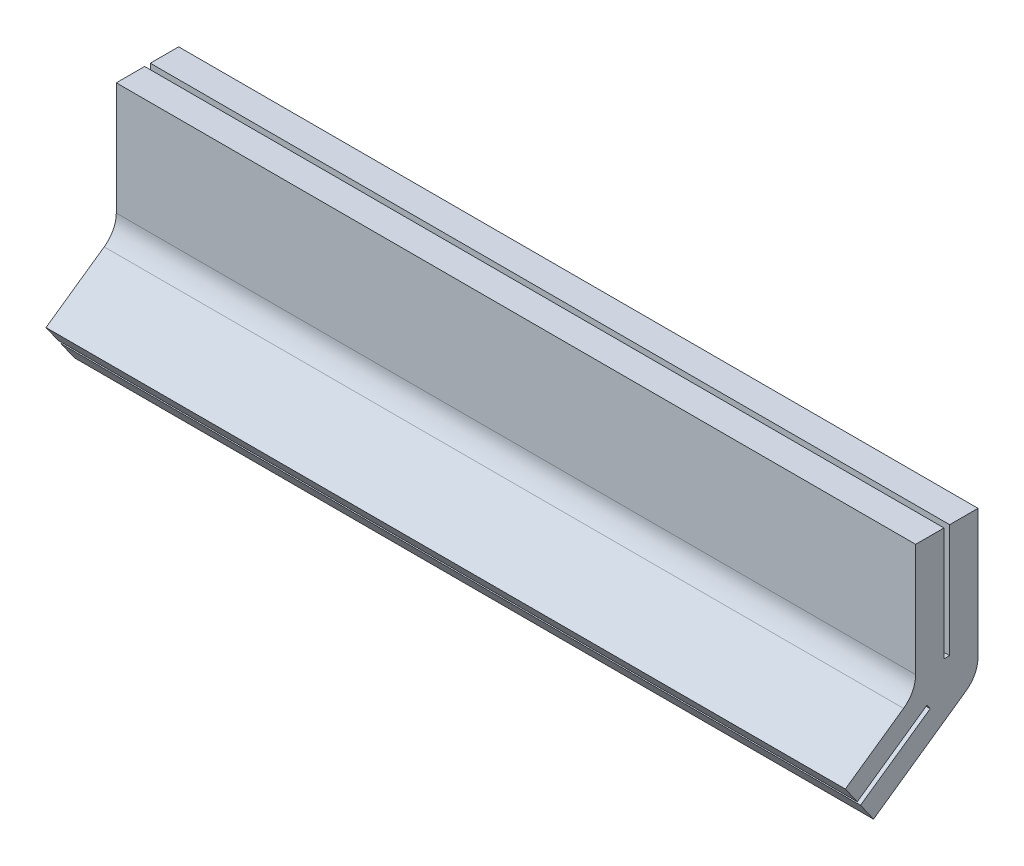
ISO-10303-21;
HEADER;
FILE_DESCRIPTION(('STEP AP214'),'2;1');
FILE_NAME('part.step','',(''),(''),'','','');
FILE_SCHEMA(('AUTOMOTIVE_DESIGN { 1 0 10303 214 1 1 1 1 }'));
ENDSEC;
DATA;
#1=APPLICATION_CONTEXT('core data for automotive mechanical design processes');
#2=APPLICATION_PROTOCOL_DEFINITION('international standard','automotive_design',2000,#1);
#3=PRODUCT_CONTEXT('',#1,'mechanical');
#4=PRODUCT('Part','Part','',(#3));
#5=PRODUCT_RELATED_PRODUCT_CATEGORY('part','',(#4));
#6=PRODUCT_DEFINITION_FORMATION('','',#4);
#7=PRODUCT_DEFINITION_CONTEXT('part definition',#1,'design');
#8=PRODUCT_DEFINITION('design','',#6,#7);
#9=PRODUCT_DEFINITION_SHAPE('','',#8);
#10=(LENGTH_UNIT() NAMED_UNIT(*) SI_UNIT(.MILLI.,.METRE.));
#11=(NAMED_UNIT(*) PLANE_ANGLE_UNIT() SI_UNIT($,.RADIAN.));
#12=(NAMED_UNIT(*) SI_UNIT($,.STERADIAN.) SOLID_ANGLE_UNIT());
#13=UNCERTAINTY_MEASURE_WITH_UNIT(LENGTH_MEASURE(1.E-05),#10,'distance_accuracy_value','');
#14=(GEOMETRIC_REPRESENTATION_CONTEXT(3) GLOBAL_UNCERTAINTY_ASSIGNED_CONTEXT((#13)) GLOBAL_UNIT_ASSIGNED_CONTEXT((#10,
#11,#12)) REPRESENTATION_CONTEXT('',''));
#15=CARTESIAN_POINT('',(0.,0.,0.));
#16=DIRECTION('',(0.,0.,1.));
#17=DIRECTION('',(1.,0.,0.));
#18=AXIS2_PLACEMENT_3D('',#15,#16,#17);
#19=CARTESIAN_POINT('',(280.717319350341,-285.,-311.284735655454));
#20=DIRECTION('',(0.,1.,0.));
#21=DIRECTION('',(0.,0.,1.));
#22=AXIS2_PLACEMENT_3D('',#19,#20,#21);
#23=PLANE('',#22);
#24=DIRECTION('',(0.,0.,-1.));
#25=VECTOR('',#24,1.);
#26=CARTESIAN_POINT('',(141.,-285.,-311.284735655454));
#27=LINE('',#26,#25);
#28=CARTESIAN_POINT('',(141.,-285.,-311.284735655454));
#29=VERTEX_POINT('',#28);
#30=CARTESIAN_POINT('',(141.,-285.,-321.284735655454));
#31=VERTEX_POINT('',#30);
#32=EDGE_CURVE('E206',#29,#31,#27,.T.);
#33=ORIENTED_EDGE('',*,*,#32,.T.);
#34=DIRECTION('',(-1.,0.,0.));
#35=VECTOR('',#34,1.);
#36=CARTESIAN_POINT('',(280.717319350341,-285.,-321.284735655454));
#37=LINE('',#36,#35);
#38=CARTESIAN_POINT('',(-141.,-285.,-321.284735655454));
#39=VERTEX_POINT('',#38);
#40=EDGE_CURVE('E258',#31,#39,#37,.T.);
#41=ORIENTED_EDGE('',*,*,#40,.T.);
#42=DIRECTION('',(0.,0.,-1.));
#43=VECTOR('',#42,1.);
#44=CARTESIAN_POINT('',(-141.,-285.,-311.284735655454));
#45=LINE('',#44,#43);
#46=CARTESIAN_POINT('',(-141.,-285.,-311.284735655454));
#47=VERTEX_POINT('',#46);
#48=EDGE_CURVE('E173',#47,#39,#45,.T.);
#49=ORIENTED_EDGE('',*,*,#48,.F.);
#50=DIRECTION('',(-1.,0.,0.));
#51=VECTOR('',#50,1.);
#52=CARTESIAN_POINT('',(280.717319350341,-285.,-311.284735655454));
#53=LINE('',#52,#51);
#54=EDGE_CURVE('E157',#29,#47,#53,.T.);
#55=ORIENTED_EDGE('',*,*,#54,.F.);
#56=EDGE_LOOP('',(#33,#41,#49,#55));
#57=FACE_BOUND('',#56,.T.);
#58=ADVANCED_FACE('F34',(#57),#23,.T.);
#59=CARTESIAN_POINT('',(141.,-200.,-321.284735655454));
#60=DIRECTION('',(1.,0.,0.));
#61=DIRECTION('',(0.,0.,-1.));
#62=AXIS2_PLACEMENT_3D('',#59,#60,#61);
#63=PLANE('',#62);
#64=DIRECTION('',(0.,1.,0.));
#65=VECTOR('',#64,1.);
#66=CARTESIAN_POINT('',(141.,-200.,-323.284735655454));
#67=LINE('',#66,#65);
#68=CARTESIAN_POINT('',(141.,-325.,-323.284735655454));
#69=VERTEX_POINT('',#68);
#70=CARTESIAN_POINT('',(141.,-285.,-323.284735655454));
#71=VERTEX_POINT('',#70);
#72=EDGE_CURVE('E194',#69,#71,#67,.T.);
#73=ORIENTED_EDGE('',*,*,#72,.F.);
#74=DIRECTION('',(0.,0.,-1.));
#75=VECTOR('',#74,1.);
#76=CARTESIAN_POINT('',(141.,-325.,-321.284735655454));
#77=LINE('',#76,#75);
#78=CARTESIAN_POINT('',(141.,-325.,-321.284735655454));
#79=VERTEX_POINT('',#78);
#80=EDGE_CURVE('E264',#79,#69,#77,.T.);
#81=ORIENTED_EDGE('',*,*,#80,.F.);
#82=DIRECTION('',(0.,1.,0.));
#83=VECTOR('',#82,1.);
#84=CARTESIAN_POINT('',(141.,-200.,-321.284735655454));
#85=LINE('',#84,#83);
#86=EDGE_CURVE('E262',#79,#31,#85,.T.);
#87=ORIENTED_EDGE('',*,*,#86,.T.);
#88=ORIENTED_EDGE('',*,*,#32,.F.);
#89=DIRECTION('',(0.,-1.,0.));
#90=VECTOR('',#89,1.);
#91=CARTESIAN_POINT('',(141.,-285.,-311.284735655454));
#92=LINE('',#91,#90);
#93=CARTESIAN_POINT('',(141.,-324.794329494483,-311.284735655454));
#94=VERTEX_POINT('',#93);
#95=EDGE_CURVE('E202',#29,#94,#92,.T.);
#96=ORIENTED_EDGE('',*,*,#95,.T.);
#97=CARTESIAN_POINT('',(141.,-324.794329494483,-301.284735655454));
#98=DIRECTION('',(1.,0.,0.));
#99=DIRECTION('',(0.,1.,0.));
#100=AXIS2_PLACEMENT_3D('',#97,#98,#99);
#101=CIRCLE('',#100,9.99999999999996);
#102=CARTESIAN_POINT('',(141.,-332.985849937373,-307.020500018964));
#103=VERTEX_POINT('',#102);
#104=EDGE_CURVE('E154',#103,#94,#101,.T.);
#105=ORIENTED_EDGE('',*,*,#104,.F.);
#106=DIRECTION('',(0.,-0.573576436351041,0.819152044288996));
#107=VECTOR('',#106,1.);
#108=CARTESIAN_POINT('',(141.,-332.985849937373,-307.020500018964));
#109=LINE('',#108,#107);
#110=CARTESIAN_POINT('',(141.,-347.361888814537,-286.489388751694));
#111=VERTEX_POINT('',#110);
#112=EDGE_CURVE('E211',#103,#111,#109,.T.);
#113=ORIENTED_EDGE('',*,*,#112,.T.);
#114=DIRECTION('',(0.,0.819152044288993,0.573576436351045));
#115=VECTOR('',#114,1.);
#116=CARTESIAN_POINT('',(141.,-353.356883609905,-290.687129298939));
#117=LINE('',#116,#115);
#118=CARTESIAN_POINT('',(141.,-353.356883609905,-290.687129298939));
#119=VERTEX_POINT('',#118);
#120=EDGE_CURVE('E216',#119,#111,#117,.T.);
#121=ORIENTED_EDGE('',*,*,#120,.F.);
#122=DIRECTION('',(0.,0.57357643635104,-0.819152044288996));
#123=VECTOR('',#122,1.);
#124=CARTESIAN_POINT('',(141.,-353.356883609905,-290.687129298939));
#125=LINE('',#124,#123);
#126=CARTESIAN_POINT('',(141.,-336.149590519374,-315.261690627609));
#127=VERTEX_POINT('',#126);
#128=EDGE_CURVE('E215',#119,#127,#125,.T.);
#129=ORIENTED_EDGE('',*,*,#128,.T.);
#130=DIRECTION('',(0.,-0.819152044288991,-0.573576436351048));
#131=VECTOR('',#130,1.);
#132=CARTESIAN_POINT('',(141.,-336.149590519374,-315.261690627609));
#133=LINE('',#132,#131);
#134=CARTESIAN_POINT('',(141.,-337.787894607952,-316.408843500311));
#135=VERTEX_POINT('',#134);
#136=EDGE_CURVE('E222',#127,#135,#133,.T.);
#137=ORIENTED_EDGE('',*,*,#136,.T.);
#138=DIRECTION('',(0.,-0.57357643635104,0.819152044288996));
#139=VECTOR('',#138,1.);
#140=CARTESIAN_POINT('',(141.,-337.787894607952,-316.408843500311));
#141=LINE('',#140,#139);
#142=CARTESIAN_POINT('',(141.,-354.994945144309,-291.834628574901));
#143=VERTEX_POINT('',#142);
#144=EDGE_CURVE('E200',#135,#143,#141,.T.);
#145=ORIENTED_EDGE('',*,*,#144,.T.);
#146=DIRECTION('',(0.,0.819182374444961,0.573533117961566));
#147=VECTOR('',#146,1.);
#148=CARTESIAN_POINT('',(141.,-361.546671381373,-296.421680364583));
#149=LINE('',#148,#147);
#150=CARTESIAN_POINT('',(141.,-361.546671381373,-296.421680364583));
#151=VERTEX_POINT('',#150);
#152=EDGE_CURVE('E58',#151,#143,#149,.T.);
#153=ORIENTED_EDGE('',*,*,#152,.F.);
#154=DIRECTION('',(0.,-0.573576436351039,0.819152044288997));
#155=VECTOR('',#154,1.);
#156=CARTESIAN_POINT('',(141.,-338.603613927331,-329.187762136143));
#157=LINE('',#156,#155);
#158=CARTESIAN_POINT('',(141.,-338.603613927331,-329.187762136143));
#159=VERTEX_POINT('',#158);
#160=EDGE_CURVE('E93',#159,#151,#157,.T.);
#161=ORIENTED_EDGE('',*,*,#160,.F.);
#162=CARTESIAN_POINT('',(141.,-330.53179391148,-323.284735655454));
#163=DIRECTION('',(1.,0.,0.));
#164=DIRECTION('',(0.,1.,0.));
#165=AXIS2_PLACEMENT_3D('',#162,#163,#164);
#166=CIRCLE('',#165,10.);
#167=CARTESIAN_POINT('',(141.,-330.53179391148,-333.284735655454));
#168=VERTEX_POINT('',#167);
#169=EDGE_CURVE('E197',#159,#168,#166,.T.);
#170=ORIENTED_EDGE('',*,*,#169,.T.);
#171=DIRECTION('',(0.,-1.,0.));
#172=VECTOR('',#171,1.);
#173=CARTESIAN_POINT('',(141.,-285.,-333.284735655454));
#174=LINE('',#173,#172);
#175=CARTESIAN_POINT('',(141.,-285.,-333.284735655454));
#176=VERTEX_POINT('',#175);
#177=EDGE_CURVE('E203',#176,#168,#174,.T.);
#178=ORIENTED_EDGE('',*,*,#177,.F.);
#179=EDGE_CURVE('E209',#71,#176,#27,.T.);
#180=ORIENTED_EDGE('',*,*,#179,.F.);
#181=EDGE_LOOP('',(#73,#81,#87,#88,#96,#105,#113,#121,#129,#137,#145,#153,#161,#170,#178,#180));
#182=FACE_BOUND('',#181,.T.);
#183=ADVANCED_FACE('F36',(#182),#63,.T.);
#184=CARTESIAN_POINT('',(280.717319350341,-338.603613927331,-329.187762136143));
#185=DIRECTION('',(0.,-0.819152044288997,-0.573576436351039));
#186=DIRECTION('',(0.,0.573576436351039,-0.819152044288997));
#187=AXIS2_PLACEMENT_3D('',#184,#185,#186);
#188=PLANE('',#187);
#189=DIRECTION('',(-1.,0.,0.));
#190=VECTOR('',#189,1.);
#191=CARTESIAN_POINT('',(280.717319350341,-338.603613927331,-329.187762136143));
#192=LINE('',#191,#190);
#193=CARTESIAN_POINT('',(-141.,-338.603613927331,-329.187762136143));
#194=VERTEX_POINT('',#193);
#195=EDGE_CURVE('E228',#159,#194,#192,.T.);
#196=ORIENTED_EDGE('',*,*,#195,.F.);
#197=ORIENTED_EDGE('',*,*,#160,.T.);
#198=DIRECTION('',(-1.,0.,0.));
#199=VECTOR('',#198,1.);
#200=CARTESIAN_POINT('',(280.717319350341,-361.546671381373,-296.421680364583));
#201=LINE('',#200,#199);
#202=CARTESIAN_POINT('',(-141.,-361.546671381373,-296.421680364583));
#203=VERTEX_POINT('',#202);
#204=EDGE_CURVE('E199',#151,#203,#201,.T.);
#205=ORIENTED_EDGE('',*,*,#204,.T.);
#206=DIRECTION('',(0.,-0.573576436351039,0.819152044288997));
#207=VECTOR('',#206,1.);
#208=CARTESIAN_POINT('',(-141.,-338.603613927331,-329.187762136143));
#209=LINE('',#208,#207);
#210=EDGE_CURVE('E165',#194,#203,#209,.T.);
#211=ORIENTED_EDGE('',*,*,#210,.F.);
#212=EDGE_LOOP('',(#196,#197,#205,#211));
#213=FACE_BOUND('',#212,.T.);
#214=ADVANCED_FACE('F292',(#213),#188,.T.);
#215=CARTESIAN_POINT('',(280.717319350341,-361.546671381373,-296.421680364583));
#216=DIRECTION('',(0.,-0.573533117961566,0.819182374444961));
#217=DIRECTION('',(0.,-0.819182374444961,-0.573533117961566));
#218=AXIS2_PLACEMENT_3D('',#215,#216,#217);
#219=PLANE('',#218);
#220=ORIENTED_EDGE('',*,*,#204,.F.);
#221=ORIENTED_EDGE('',*,*,#152,.T.);
#222=DIRECTION('',(-1.,0.,0.));
#223=VECTOR('',#222,1.);
#224=CARTESIAN_POINT('',(280.717319350341,-354.994945144309,-291.834628574901));
#225=LINE('',#224,#223);
#226=CARTESIAN_POINT('',(-141.,-354.994945144309,-291.834628574901));
#227=VERTEX_POINT('',#226);
#228=EDGE_CURVE('E226',#143,#227,#225,.T.);
#229=ORIENTED_EDGE('',*,*,#228,.T.);
#230=DIRECTION('',(0.,0.819182374444961,0.573533117961566));
#231=VECTOR('',#230,1.);
#232=CARTESIAN_POINT('',(-141.,-361.546671381373,-296.421680364583));
#233=LINE('',#232,#231);
#234=EDGE_CURVE('E175',#203,#227,#233,.T.);
#235=ORIENTED_EDGE('',*,*,#234,.F.);
#236=EDGE_LOOP('',(#220,#221,#229,#235));
#237=FACE_BOUND('',#236,.T.);
#238=ADVANCED_FACE('F295',(#237),#219,.T.);
#239=CARTESIAN_POINT('',(280.717319350341,-337.787894607952,-316.408843500311));
#240=DIRECTION('',(0.,-0.819152044288996,-0.57357643635104));
#241=DIRECTION('',(0.,0.57357643635104,-0.819152044288996));
#242=AXIS2_PLACEMENT_3D('',#239,#240,#241);
#243=PLANE('',#242);
#244=ORIENTED_EDGE('',*,*,#144,.F.);
#245=DIRECTION('',(-1.,0.,0.));
#246=VECTOR('',#245,1.);
#247=CARTESIAN_POINT('',(280.717319350341,-337.787894607952,-316.408843500311));
#248=LINE('',#247,#246);
#249=CARTESIAN_POINT('',(-141.,-337.787894607952,-316.408843500311));
#250=VERTEX_POINT('',#249);
#251=EDGE_CURVE('E236',#135,#250,#248,.T.);
#252=ORIENTED_EDGE('',*,*,#251,.T.);
#253=DIRECTION('',(0.,-0.57357643635104,0.819152044288996));
#254=VECTOR('',#253,1.);
#255=CARTESIAN_POINT('',(-141.,-337.787894607952,-316.408843500311));
#256=LINE('',#255,#254);
#257=EDGE_CURVE('E185',#250,#227,#256,.T.);
#258=ORIENTED_EDGE('',*,*,#257,.T.);
#259=ORIENTED_EDGE('',*,*,#228,.F.);
#260=EDGE_LOOP('',(#244,#252,#258,#259));
#261=FACE_BOUND('',#260,.T.);
#262=ADVANCED_FACE('F302',(#261),#243,.F.);
#263=CARTESIAN_POINT('',(280.717319350341,-336.149590519374,-315.261690627609));
#264=DIRECTION('',(0.,0.573576436351048,-0.819152044288991));
#265=DIRECTION('',(0.,0.819152044288991,0.573576436351048));
#266=AXIS2_PLACEMENT_3D('',#263,#264,#265);
#267=PLANE('',#266);
#268=ORIENTED_EDGE('',*,*,#136,.F.);
#269=DIRECTION('',(-1.,0.,0.));
#270=VECTOR('',#269,1.);
#271=CARTESIAN_POINT('',(280.717319350341,-336.149590519374,-315.261690627609));
#272=LINE('',#271,#270);
#273=CARTESIAN_POINT('',(-141.,-336.149590519374,-315.261690627609));
#274=VERTEX_POINT('',#273);
#275=EDGE_CURVE('E234',#127,#274,#272,.T.);
#276=ORIENTED_EDGE('',*,*,#275,.T.);
#277=DIRECTION('',(0.,-0.819152044288991,-0.573576436351048));
#278=VECTOR('',#277,1.);
#279=CARTESIAN_POINT('',(-141.,-336.149590519374,-315.261690627609));
#280=LINE('',#279,#278);
#281=EDGE_CURVE('E182',#274,#250,#280,.T.);
#282=ORIENTED_EDGE('',*,*,#281,.T.);
#283=ORIENTED_EDGE('',*,*,#251,.F.);
#284=EDGE_LOOP('',(#268,#276,#282,#283));
#285=FACE_BOUND('',#284,.T.);
#286=ADVANCED_FACE('F306',(#285),#267,.F.);
#287=CARTESIAN_POINT('',(280.717319350341,-353.356883609905,-290.687129298939));
#288=DIRECTION('',(0.,0.819152044288996,0.57357643635104));
#289=DIRECTION('',(0.,-0.57357643635104,0.819152044288996));
#290=AXIS2_PLACEMENT_3D('',#287,#288,#289);
#291=PLANE('',#290);
#292=ORIENTED_EDGE('',*,*,#128,.F.);
#293=DIRECTION('',(-1.,0.,0.));
#294=VECTOR('',#293,1.);
#295=CARTESIAN_POINT('',(280.717319350341,-353.356883609905,-290.687129298939));
#296=LINE('',#295,#294);
#297=CARTESIAN_POINT('',(-141.,-353.356883609905,-290.687129298939));
#298=VERTEX_POINT('',#297);
#299=EDGE_CURVE('E220',#119,#298,#296,.T.);
#300=ORIENTED_EDGE('',*,*,#299,.T.);
#301=DIRECTION('',(0.,0.57357643635104,-0.819152044288996));
#302=VECTOR('',#301,1.);
#303=CARTESIAN_POINT('',(-141.,-353.356883609905,-290.687129298939));
#304=LINE('',#303,#302);
#305=EDGE_CURVE('E178',#298,#274,#304,.T.);
#306=ORIENTED_EDGE('',*,*,#305,.T.);
#307=ORIENTED_EDGE('',*,*,#275,.F.);
#308=EDGE_LOOP('',(#292,#300,#306,#307));
#309=FACE_BOUND('',#308,.T.);
#310=ADVANCED_FACE('F310',(#309),#291,.F.);
#311=CARTESIAN_POINT('',(280.717319350341,-353.356883609905,-290.687129298939));
#312=DIRECTION('',(0.,-0.573576436351045,0.819152044288993));
#313=DIRECTION('',(0.,-0.819152044288993,-0.573576436351045));
#314=AXIS2_PLACEMENT_3D('',#311,#312,#313);
#315=PLANE('',#314);
#316=ORIENTED_EDGE('',*,*,#299,.F.);
#317=ORIENTED_EDGE('',*,*,#120,.T.);
#318=DIRECTION('',(-1.,0.,0.));
#319=VECTOR('',#318,1.);
#320=CARTESIAN_POINT('',(280.717319350341,-347.361888814537,-286.489388751694));
#321=LINE('',#320,#319);
#322=CARTESIAN_POINT('',(-141.,-347.361888814537,-286.489388751694));
#323=VERTEX_POINT('',#322);
#324=EDGE_CURVE('E219',#111,#323,#321,.T.);
#325=ORIENTED_EDGE('',*,*,#324,.T.);
#326=DIRECTION('',(0.,0.819152044288993,0.573576436351045));
#327=VECTOR('',#326,1.);
#328=CARTESIAN_POINT('',(-141.,-353.356883609905,-290.687129298939));
#329=LINE('',#328,#327);
#330=EDGE_CURVE('E171',#298,#323,#329,.T.);
#331=ORIENTED_EDGE('',*,*,#330,.F.);
#332=EDGE_LOOP('',(#316,#317,#325,#331));
#333=FACE_BOUND('',#332,.T.);
#334=ADVANCED_FACE('F314',(#333),#315,.T.);
#335=CARTESIAN_POINT('',(280.717319350341,-332.985849937373,-307.020500018964));
#336=DIRECTION('',(0.,-0.819152044288996,-0.573576436351041));
#337=DIRECTION('',(0.,0.573576436351041,-0.819152044288996));
#338=AXIS2_PLACEMENT_3D('',#335,#336,#337);
#339=PLANE('',#338);
#340=ORIENTED_EDGE('',*,*,#112,.F.);
#341=DIRECTION('',(-1.,0.,0.));
#342=VECTOR('',#341,1.);
#343=CARTESIAN_POINT('',(280.717319350341,-332.985849937373,-307.020500018964));
#344=LINE('',#343,#342);
#345=CARTESIAN_POINT('',(-141.,-332.985849937373,-307.020500018964));
#346=VERTEX_POINT('',#345);
#347=EDGE_CURVE('E213',#103,#346,#344,.T.);
#348=ORIENTED_EDGE('',*,*,#347,.T.);
#349=DIRECTION('',(0.,-0.573576436351041,0.819152044288996));
#350=VECTOR('',#349,1.);
#351=CARTESIAN_POINT('',(-141.,-332.985849937373,-307.020500018964));
#352=LINE('',#351,#350);
#353=EDGE_CURVE('E166',#346,#323,#352,.T.);
#354=ORIENTED_EDGE('',*,*,#353,.T.);
#355=ORIENTED_EDGE('',*,*,#324,.F.);
#356=EDGE_LOOP('',(#340,#348,#354,#355));
#357=FACE_BOUND('',#356,.T.);
#358=ADVANCED_FACE('F318',(#357),#339,.F.);
#359=CARTESIAN_POINT('',(280.717319350341,-324.794329494483,-301.284735655454));
#360=DIRECTION('',(-1.,0.,0.));
#361=DIRECTION('',(0.,0.,1.));
#362=AXIS2_PLACEMENT_3D('',#359,#360,#361);
#363=CYLINDRICAL_SURFACE('',#362,9.99999999999996);
#364=ORIENTED_EDGE('',*,*,#347,.F.);
#365=ORIENTED_EDGE('',*,*,#104,.T.);
#366=DIRECTION('',(-1.,0.,0.));
#367=VECTOR('',#366,1.);
#368=CARTESIAN_POINT('',(280.717319350341,-324.794329494483,-311.284735655454));
#369=LINE('',#368,#367);
#370=CARTESIAN_POINT('',(-141.,-324.794329494483,-311.284735655454));
#371=VERTEX_POINT('',#370);
#372=EDGE_CURVE('E147',#94,#371,#369,.T.);
#373=ORIENTED_EDGE('',*,*,#372,.T.);
#374=CARTESIAN_POINT('',(-141.,-324.794329494483,-301.284735655454));
#375=DIRECTION('',(-1.,0.,0.));
#376=DIRECTION('',(0.,-1.,0.));
#377=AXIS2_PLACEMENT_3D('',#374,#375,#376);
#378=CIRCLE('',#377,9.99999999999996);
#379=EDGE_CURVE('E152',#346,#371,#378,.F.);
#380=ORIENTED_EDGE('',*,*,#379,.F.);
#381=EDGE_LOOP('',(#364,#365,#373,#380));
#382=FACE_BOUND('',#381,.T.);
#383=ADVANCED_FACE('F150',(#382),#363,.F.);
#384=CARTESIAN_POINT('',(280.717319350341,-285.,-311.284735655454));
#385=DIRECTION('',(0.,0.,-1.));
#386=DIRECTION('',(-1.,0.,0.));
#387=AXIS2_PLACEMENT_3D('',#384,#385,#386);
#388=PLANE('',#387);
#389=ORIENTED_EDGE('',*,*,#95,.F.);
#390=ORIENTED_EDGE('',*,*,#54,.T.);
#391=DIRECTION('',(0.,-1.,0.));
#392=VECTOR('',#391,1.);
#393=CARTESIAN_POINT('',(-141.,-285.,-311.284735655454));
#394=LINE('',#393,#392);
#395=EDGE_CURVE('E160',#47,#371,#394,.T.);
#396=ORIENTED_EDGE('',*,*,#395,.T.);
#397=ORIENTED_EDGE('',*,*,#372,.F.);
#398=EDGE_LOOP('',(#389,#390,#396,#397));
#399=FACE_BOUND('',#398,.T.);
#400=ADVANCED_FACE('F161',(#399),#388,.F.);
#401=DIRECTION('',(-1.,0.,0.));
#402=VECTOR('',#401,1.);
#403=CARTESIAN_POINT('',(280.717319350341,-285.,-323.284735655454));
#404=LINE('',#403,#402);
#405=CARTESIAN_POINT('',(-141.,-285.,-323.284735655454));
#406=VERTEX_POINT('',#405);
#407=EDGE_CURVE('E270',#71,#406,#404,.T.);
#408=ORIENTED_EDGE('',*,*,#407,.F.);
#409=ORIENTED_EDGE('',*,*,#179,.T.);
#410=DIRECTION('',(-1.,0.,0.));
#411=VECTOR('',#410,1.);
#412=CARTESIAN_POINT('',(280.717319350341,-285.,-333.284735655454));
#413=LINE('',#412,#411);
#414=CARTESIAN_POINT('',(-141.,-285.,-333.284735655454));
#415=VERTEX_POINT('',#414);
#416=EDGE_CURVE('E205',#176,#415,#413,.T.);
#417=ORIENTED_EDGE('',*,*,#416,.T.);
#418=EDGE_CURVE('E110',#406,#415,#45,.T.);
#419=ORIENTED_EDGE('',*,*,#418,.F.);
#420=EDGE_LOOP('',(#408,#409,#417,#419));
#421=FACE_BOUND('',#420,.T.);
#422=ADVANCED_FACE('F282',(#421),#23,.T.);
#423=CARTESIAN_POINT('',(280.717319350341,-285.,-333.284735655454));
#424=DIRECTION('',(0.,0.,-1.));
#425=DIRECTION('',(-1.,0.,0.));
#426=AXIS2_PLACEMENT_3D('',#423,#424,#425);
#427=PLANE('',#426);
#428=ORIENTED_EDGE('',*,*,#416,.F.);
#429=ORIENTED_EDGE('',*,*,#177,.T.);
#430=DIRECTION('',(-1.,0.,0.));
#431=VECTOR('',#430,1.);
#432=CARTESIAN_POINT('',(280.717319350341,-330.53179391148,-333.284735655454));
#433=LINE('',#432,#431);
#434=CARTESIAN_POINT('',(-141.,-330.53179391148,-333.284735655454));
#435=VERTEX_POINT('',#434);
#436=EDGE_CURVE('E101',#168,#435,#433,.T.);
#437=ORIENTED_EDGE('',*,*,#436,.T.);
#438=DIRECTION('',(0.,-1.,0.));
#439=VECTOR('',#438,1.);
#440=CARTESIAN_POINT('',(-141.,-285.,-333.284735655454));
#441=LINE('',#440,#439);
#442=EDGE_CURVE('E195',#415,#435,#441,.T.);
#443=ORIENTED_EDGE('',*,*,#442,.F.);
#444=EDGE_LOOP('',(#428,#429,#437,#443));
#445=FACE_BOUND('',#444,.T.);
#446=ADVANCED_FACE('F285',(#445),#427,.T.);
#447=CARTESIAN_POINT('',(280.717319350341,-330.53179391148,-323.284735655454));
#448=DIRECTION('',(-1.,0.,0.));
#449=DIRECTION('',(0.,0.,1.));
#450=AXIS2_PLACEMENT_3D('',#447,#448,#449);
#451=CYLINDRICAL_SURFACE('',#450,10.);
#452=ORIENTED_EDGE('',*,*,#169,.F.);
#453=ORIENTED_EDGE('',*,*,#195,.T.);
#454=CARTESIAN_POINT('',(-141.,-330.53179391148,-323.284735655454));
#455=DIRECTION('',(-1.,0.,0.));
#456=DIRECTION('',(0.,-1.,0.));
#457=AXIS2_PLACEMENT_3D('',#454,#455,#456);
#458=CIRCLE('',#457,10.);
#459=EDGE_CURVE('E188',#194,#435,#458,.F.);
#460=ORIENTED_EDGE('',*,*,#459,.T.);
#461=ORIENTED_EDGE('',*,*,#436,.F.);
#462=EDGE_LOOP('',(#452,#453,#460,#461));
#463=FACE_BOUND('',#462,.T.);
#464=ADVANCED_FACE('F289',(#463),#451,.T.);
#465=CARTESIAN_POINT('',(-141.,-325.,-321.284735655454));
#466=DIRECTION('',(-1.,0.,0.));
#467=DIRECTION('',(0.,0.,1.));
#468=AXIS2_PLACEMENT_3D('',#465,#466,#467);
#469=PLANE('',#468);
#470=DIRECTION('',(0.,-1.,0.));
#471=VECTOR('',#470,1.);
#472=CARTESIAN_POINT('',(-141.,-325.,-323.284735655454));
#473=LINE('',#472,#471);
#474=CARTESIAN_POINT('',(-141.,-325.,-323.284735655454));
#475=VERTEX_POINT('',#474);
#476=EDGE_CURVE('E11',#406,#475,#473,.T.);
#477=ORIENTED_EDGE('',*,*,#476,.F.);
#478=ORIENTED_EDGE('',*,*,#418,.T.);
#479=ORIENTED_EDGE('',*,*,#442,.T.);
#480=ORIENTED_EDGE('',*,*,#459,.F.);
#481=ORIENTED_EDGE('',*,*,#210,.T.);
#482=ORIENTED_EDGE('',*,*,#234,.T.);
#483=ORIENTED_EDGE('',*,*,#257,.F.);
#484=ORIENTED_EDGE('',*,*,#281,.F.);
#485=ORIENTED_EDGE('',*,*,#305,.F.);
#486=ORIENTED_EDGE('',*,*,#330,.T.);
#487=ORIENTED_EDGE('',*,*,#353,.F.);
#488=ORIENTED_EDGE('',*,*,#379,.T.);
#489=ORIENTED_EDGE('',*,*,#395,.F.);
#490=ORIENTED_EDGE('',*,*,#48,.T.);
#491=DIRECTION('',(0.,-1.,0.));
#492=VECTOR('',#491,1.);
#493=CARTESIAN_POINT('',(-141.,-325.,-321.284735655454));
#494=LINE('',#493,#492);
#495=CARTESIAN_POINT('',(-141.,-325.,-321.284735655454));
#496=VERTEX_POINT('',#495);
#497=EDGE_CURVE('E241',#39,#496,#494,.T.);
#498=ORIENTED_EDGE('',*,*,#497,.T.);
#499=DIRECTION('',(0.,0.,1.));
#500=VECTOR('',#499,1.);
#501=CARTESIAN_POINT('',(-141.,-325.,-321.284735655454));
#502=LINE('',#501,#500);
#503=EDGE_CURVE('E42',#475,#496,#502,.T.);
#504=ORIENTED_EDGE('',*,*,#503,.F.);
#505=EDGE_LOOP('',(#477,#478,#479,#480,#481,#482,#483,#484,#485,#486,#487,#488,#489,#490,#498,#504));
#506=FACE_BOUND('',#505,.T.);
#507=ADVANCED_FACE('F168',(#506),#469,.T.);
#508=CARTESIAN_POINT('',(-191.,-250.,-323.284735655454));
#509=DIRECTION('',(0.,0.,-1.));
#510=DIRECTION('',(-1.,0.,0.));
#511=AXIS2_PLACEMENT_3D('',#508,#509,#510);
#512=PLANE('',#511);
#513=ORIENTED_EDGE('',*,*,#72,.T.);
#514=ORIENTED_EDGE('',*,*,#407,.T.);
#515=ORIENTED_EDGE('',*,*,#476,.T.);
#516=DIRECTION('',(-1.,0.,0.));
#517=VECTOR('',#516,1.);
#518=CARTESIAN_POINT('',(191.,-325.,-323.284735655454));
#519=LINE('',#518,#517);
#520=EDGE_CURVE('E252',#69,#475,#519,.T.);
#521=ORIENTED_EDGE('',*,*,#520,.F.);
#522=EDGE_LOOP('',(#513,#514,#515,#521));
#523=FACE_BOUND('',#522,.T.);
#524=ADVANCED_FACE('F277',(#523),#512,.F.);
#525=CARTESIAN_POINT('',(191.,-325.,-321.284735655454));
#526=DIRECTION('',(0.,-1.,0.));
#527=DIRECTION('',(1.,0.,0.));
#528=AXIS2_PLACEMENT_3D('',#525,#526,#527);
#529=PLANE('',#528);
#530=ORIENTED_EDGE('',*,*,#80,.T.);
#531=ORIENTED_EDGE('',*,*,#520,.T.);
#532=ORIENTED_EDGE('',*,*,#503,.T.);
#533=DIRECTION('',(-1.,0.,0.));
#534=VECTOR('',#533,1.);
#535=CARTESIAN_POINT('',(191.,-325.,-321.284735655454));
#536=LINE('',#535,#534);
#537=EDGE_CURVE('E49',#79,#496,#536,.T.);
#538=ORIENTED_EDGE('',*,*,#537,.F.);
#539=EDGE_LOOP('',(#530,#531,#532,#538));
#540=FACE_BOUND('',#539,.T.);
#541=ADVANCED_FACE('F247',(#540),#529,.F.);
#542=CARTESIAN_POINT('',(-191.,-250.,-321.284735655454));
#543=DIRECTION('',(0.,0.,-1.));
#544=DIRECTION('',(-1.,0.,0.));
#545=AXIS2_PLACEMENT_3D('',#542,#543,#544);
#546=PLANE('',#545);
#547=ORIENTED_EDGE('',*,*,#537,.T.);
#548=ORIENTED_EDGE('',*,*,#497,.F.);
#549=ORIENTED_EDGE('',*,*,#40,.F.);
#550=ORIENTED_EDGE('',*,*,#86,.F.);
#551=EDGE_LOOP('',(#547,#548,#549,#550));
#552=FACE_BOUND('',#551,.T.);
#553=ADVANCED_FACE('F256',(#552),#546,.T.);
#554=CLOSED_SHELL('',(#58,#183,#214,#238,#262,#286,#310,#334,#358,#383,#400,#422,#446,#464,#507,
#524,#541,#553));
#555=MANIFOLD_SOLID_BREP('B2',#554);
#556=ADVANCED_BREP_SHAPE_REPRESENTATION('',(#18,#555),#14);
#557=SHAPE_DEFINITION_REPRESENTATION(#9,#556);
ENDSEC;
END-ISO-10303-21;
